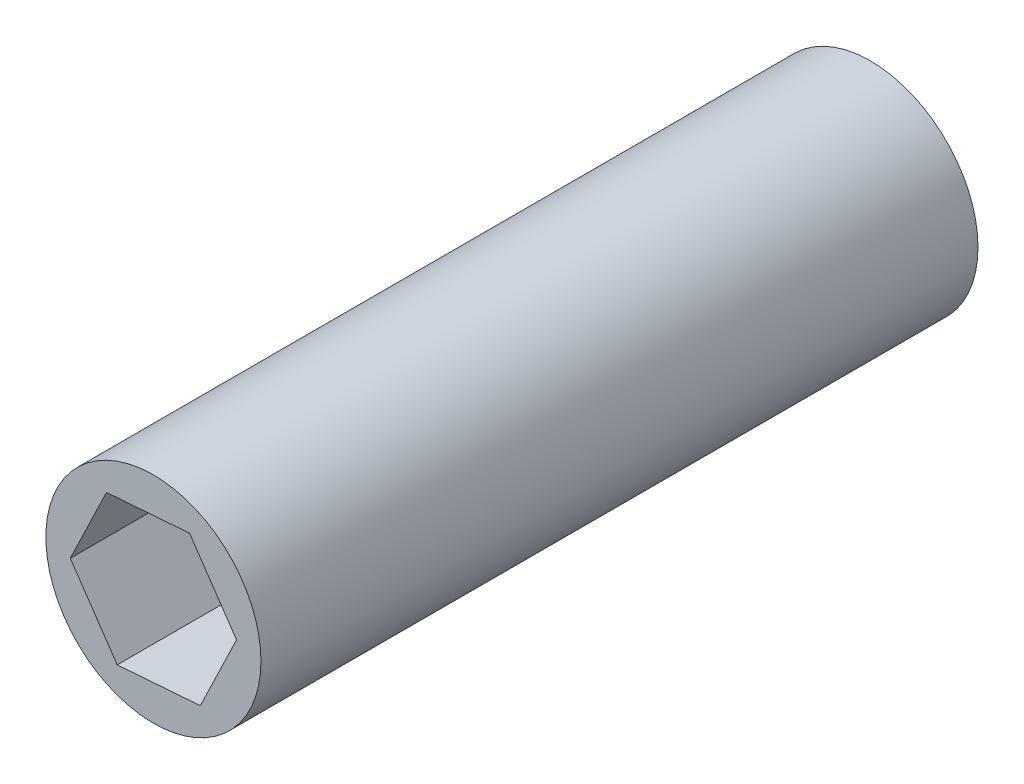
ISO-10303-21;
HEADER;
FILE_DESCRIPTION(('STEP AP214'),'2;1');
FILE_NAME('part.step','',(''),(''),'','','');
FILE_SCHEMA(('AUTOMOTIVE_DESIGN { 1 0 10303 214 1 1 1 1 }'));
ENDSEC;
DATA;
#1=APPLICATION_CONTEXT('core data for automotive mechanical design processes');
#2=APPLICATION_PROTOCOL_DEFINITION('international standard','automotive_design',2000,#1);
#3=PRODUCT_CONTEXT('',#1,'mechanical');
#4=PRODUCT('Part','Part','',(#3));
#5=PRODUCT_RELATED_PRODUCT_CATEGORY('part','',(#4));
#6=PRODUCT_DEFINITION_FORMATION('','',#4);
#7=PRODUCT_DEFINITION_CONTEXT('part definition',#1,'design');
#8=PRODUCT_DEFINITION('design','',#6,#7);
#9=PRODUCT_DEFINITION_SHAPE('','',#8);
#10=(LENGTH_UNIT() NAMED_UNIT(*) SI_UNIT(.MILLI.,.METRE.));
#11=(NAMED_UNIT(*) PLANE_ANGLE_UNIT() SI_UNIT($,.RADIAN.));
#12=(NAMED_UNIT(*) SI_UNIT($,.STERADIAN.) SOLID_ANGLE_UNIT());
#13=UNCERTAINTY_MEASURE_WITH_UNIT(LENGTH_MEASURE(1.E-05),#10,'distance_accuracy_value','');
#14=(GEOMETRIC_REPRESENTATION_CONTEXT(3) GLOBAL_UNCERTAINTY_ASSIGNED_CONTEXT((#13)) GLOBAL_UNIT_ASSIGNED_CONTEXT((#10,
#11,#12)) REPRESENTATION_CONTEXT('',''));
#15=CARTESIAN_POINT('',(0.,0.,0.));
#16=DIRECTION('',(0.,0.,1.));
#17=DIRECTION('',(1.,0.,0.));
#18=AXIS2_PLACEMENT_3D('',#15,#16,#17);
#19=CARTESIAN_POINT('',(0.,0.,10.));
#20=DIRECTION('',(0.,0.,-1.));
#21=DIRECTION('',(-1.,0.,0.));
#22=AXIS2_PLACEMENT_3D('',#19,#20,#21);
#23=CYLINDRICAL_SURFACE('',#22,1.5);
#24=CARTESIAN_POINT('',(0.,0.,10.));
#25=DIRECTION('',(0.,0.,1.));
#26=DIRECTION('',(1.,0.,0.));
#27=AXIS2_PLACEMENT_3D('',#24,#25,#26);
#28=CIRCLE('',#27,1.5);
#29=CARTESIAN_POINT('',(1.5,0.,10.));
#30=VERTEX_POINT('',#29);
#31=EDGE_CURVE('E11',#30,#30,#28,.T.);
#32=ORIENTED_EDGE('',*,*,#31,.F.);
#33=EDGE_LOOP('',(#32));
#34=FACE_BOUND('',#33,.T.);
#35=CARTESIAN_POINT('',(0.,0.,0.));
#36=DIRECTION('',(0.,0.,1.));
#37=DIRECTION('',(1.,0.,0.));
#38=AXIS2_PLACEMENT_3D('',#35,#36,#37);
#39=CIRCLE('',#38,1.5);
#40=CARTESIAN_POINT('',(1.5,0.,0.));
#41=VERTEX_POINT('',#40);
#42=EDGE_CURVE('E37',#41,#41,#39,.T.);
#43=ORIENTED_EDGE('',*,*,#42,.T.);
#44=EDGE_LOOP('',(#43));
#45=FACE_BOUND('',#44,.T.);
#46=ADVANCED_FACE('F34',(#34,#45),#23,.T.);
#47=CARTESIAN_POINT('',(0.,0.,10.));
#48=DIRECTION('',(0.,0.,1.));
#49=DIRECTION('',(1.,0.,0.));
#50=AXIS2_PLACEMENT_3D('',#47,#48,#49);
#51=PLANE('',#50);
#52=DIRECTION('',(0.997226662641607,0.0744243462630441,0.));
#53=VECTOR('',#52,1.);
#54=CARTESIAN_POINT('',(-0.50460022829491,-1.04699187789675,10.));
#55=LINE('',#54,#53);
#56=CARTESIAN_POINT('',(-0.50460022829491,-1.04699187789675,10.));
#57=VERTEX_POINT('',#56);
#58=CARTESIAN_POINT('',(0.654421449667105,-0.960492555407194,10.));
#59=VERTEX_POINT('',#58);
#60=EDGE_CURVE('E48',#57,#59,#55,.T.);
#61=ORIENTED_EDGE('',*,*,#60,.F.);
#62=DIRECTION('',(0.563066705844649,-0.826411450047284,0.));
#63=VECTOR('',#62,1.);
#64=CARTESIAN_POINT('',(-1.15902167796201,-0.0864993224895553,10.));
#65=LINE('',#64,#63);
#66=CARTESIAN_POINT('',(-1.15902167796201,-0.0864993224895553,10.));
#67=VERTEX_POINT('',#66);
#68=EDGE_CURVE('E131',#67,#57,#65,.T.);
#69=ORIENTED_EDGE('',*,*,#68,.F.);
#70=DIRECTION('',(-0.434159956796958,-0.900835796310329,0.));
#71=VECTOR('',#70,1.);
#72=CARTESIAN_POINT('',(-0.654421449667105,0.960492555407194,10.));
#73=LINE('',#72,#71);
#74=CARTESIAN_POINT('',(-0.654421449667105,0.960492555407194,10.));
#75=VERTEX_POINT('',#74);
#76=EDGE_CURVE('E129',#75,#67,#73,.T.);
#77=ORIENTED_EDGE('',*,*,#76,.F.);
#78=DIRECTION('',(-0.997226662641607,-0.074424346263044,0.));
#79=VECTOR('',#78,1.);
#80=CARTESIAN_POINT('',(0.50460022829491,1.04699187789675,10.));
#81=LINE('',#80,#79);
#82=CARTESIAN_POINT('',(0.50460022829491,1.04699187789675,10.));
#83=VERTEX_POINT('',#82);
#84=EDGE_CURVE('E96',#83,#75,#81,.T.);
#85=ORIENTED_EDGE('',*,*,#84,.F.);
#86=DIRECTION('',(-0.563066705844649,0.826411450047284,0.));
#87=VECTOR('',#86,1.);
#88=CARTESIAN_POINT('',(1.15902167796202,0.0864993224895553,10.));
#89=LINE('',#88,#87);
#90=CARTESIAN_POINT('',(1.15902167796202,0.0864993224895553,10.));
#91=VERTEX_POINT('',#90);
#92=EDGE_CURVE('E125',#91,#83,#89,.T.);
#93=ORIENTED_EDGE('',*,*,#92,.F.);
#94=DIRECTION('',(0.434159956796958,0.900835796310328,0.));
#95=VECTOR('',#94,1.);
#96=CARTESIAN_POINT('',(0.654421449667105,-0.960492555407194,10.));
#97=LINE('',#96,#95);
#98=EDGE_CURVE('E122',#59,#91,#97,.T.);
#99=ORIENTED_EDGE('',*,*,#98,.F.);
#100=EDGE_LOOP('',(#61,#69,#77,#85,#93,#99));
#101=FACE_BOUND('',#100,.T.);
#102=ORIENTED_EDGE('',*,*,#31,.T.);
#103=EDGE_LOOP('',(#102));
#104=FACE_BOUND('',#103,.T.);
#105=ADVANCED_FACE('F144',(#101,#104),#51,.T.);
#106=CARTESIAN_POINT('',(0.,0.,0.));
#107=DIRECTION('',(0.,0.,1.));
#108=DIRECTION('',(1.,0.,0.));
#109=AXIS2_PLACEMENT_3D('',#106,#107,#108);
#110=PLANE('',#109);
#111=ORIENTED_EDGE('',*,*,#42,.F.);
#112=EDGE_LOOP('',(#111));
#113=FACE_BOUND('',#112,.T.);
#114=ADVANCED_FACE('F153',(#113),#110,.F.);
#115=CARTESIAN_POINT('',(-0.50460022829491,-1.04699187789675,7.));
#116=DIRECTION('',(0.0744243462630441,-0.997226662641608,0.));
#117=DIRECTION('',(0.997226662641608,0.0744243462630441,0.));
#118=AXIS2_PLACEMENT_3D('',#115,#116,#117);
#119=PLANE('',#118);
#120=ORIENTED_EDGE('',*,*,#60,.T.);
#121=DIRECTION('',(0.,0.,1.));
#122=VECTOR('',#121,1.);
#123=CARTESIAN_POINT('',(0.654421449667105,-0.960492555407194,7.));
#124=LINE('',#123,#122);
#125=CARTESIAN_POINT('',(0.654421449667105,-0.960492555407194,7.));
#126=VERTEX_POINT('',#125);
#127=EDGE_CURVE('E78',#126,#59,#124,.T.);
#128=ORIENTED_EDGE('',*,*,#127,.F.);
#129=DIRECTION('',(0.997226662641607,0.0744243462630441,0.));
#130=VECTOR('',#129,1.);
#131=CARTESIAN_POINT('',(-0.50460022829491,-1.04699187789675,7.));
#132=LINE('',#131,#130);
#133=CARTESIAN_POINT('',(-0.50460022829491,-1.04699187789675,7.));
#134=VERTEX_POINT('',#133);
#135=EDGE_CURVE('E133',#134,#126,#132,.T.);
#136=ORIENTED_EDGE('',*,*,#135,.F.);
#137=DIRECTION('',(0.,0.,1.));
#138=VECTOR('',#137,1.);
#139=CARTESIAN_POINT('',(-0.50460022829491,-1.04699187789675,7.));
#140=LINE('',#139,#138);
#141=EDGE_CURVE('E56',#134,#57,#140,.T.);
#142=ORIENTED_EDGE('',*,*,#141,.T.);
#143=EDGE_LOOP('',(#120,#128,#136,#142));
#144=FACE_BOUND('',#143,.T.);
#145=ADVANCED_FACE('F150',(#144),#119,.F.);
#146=CARTESIAN_POINT('',(-1.15902167796201,-0.0864993224895553,7.));
#147=DIRECTION('',(-0.826411450047284,-0.563066705844649,0.));
#148=DIRECTION('',(0.563066705844649,-0.826411450047284,0.));
#149=AXIS2_PLACEMENT_3D('',#146,#147,#148);
#150=PLANE('',#149);
#151=ORIENTED_EDGE('',*,*,#68,.T.);
#152=ORIENTED_EDGE('',*,*,#141,.F.);
#153=DIRECTION('',(0.563066705844649,-0.826411450047284,0.));
#154=VECTOR('',#153,1.);
#155=CARTESIAN_POINT('',(-1.15902167796201,-0.0864993224895553,7.));
#156=LINE('',#155,#154);
#157=CARTESIAN_POINT('',(-1.15902167796201,-0.0864993224895553,7.));
#158=VERTEX_POINT('',#157);
#159=EDGE_CURVE('E108',#158,#134,#156,.T.);
#160=ORIENTED_EDGE('',*,*,#159,.F.);
#161=DIRECTION('',(0.,0.,1.));
#162=VECTOR('',#161,1.);
#163=CARTESIAN_POINT('',(-1.15902167796201,-0.0864993224895553,7.));
#164=LINE('',#163,#162);
#165=EDGE_CURVE('E100',#158,#67,#164,.T.);
#166=ORIENTED_EDGE('',*,*,#165,.T.);
#167=EDGE_LOOP('',(#151,#152,#160,#166));
#168=FACE_BOUND('',#167,.T.);
#169=ADVANCED_FACE('F152',(#168),#150,.F.);
#170=CARTESIAN_POINT('',(-0.654421449667105,0.960492555407194,7.));
#171=DIRECTION('',(-0.900835796310328,0.434159956796958,0.));
#172=DIRECTION('',(-0.434159956796958,-0.900835796310328,0.));
#173=AXIS2_PLACEMENT_3D('',#170,#171,#172);
#174=PLANE('',#173);
#175=ORIENTED_EDGE('',*,*,#76,.T.);
#176=ORIENTED_EDGE('',*,*,#165,.F.);
#177=DIRECTION('',(-0.434159956796958,-0.900835796310329,0.));
#178=VECTOR('',#177,1.);
#179=CARTESIAN_POINT('',(-0.654421449667105,0.960492555407194,7.));
#180=LINE('',#179,#178);
#181=CARTESIAN_POINT('',(-0.654421449667105,0.960492555407194,7.));
#182=VERTEX_POINT('',#181);
#183=EDGE_CURVE('E104',#182,#158,#180,.T.);
#184=ORIENTED_EDGE('',*,*,#183,.F.);
#185=DIRECTION('',(0.,0.,1.));
#186=VECTOR('',#185,1.);
#187=CARTESIAN_POINT('',(-0.654421449667105,0.960492555407194,7.));
#188=LINE('',#187,#186);
#189=EDGE_CURVE('E89',#182,#75,#188,.T.);
#190=ORIENTED_EDGE('',*,*,#189,.T.);
#191=EDGE_LOOP('',(#175,#176,#184,#190));
#192=FACE_BOUND('',#191,.T.);
#193=ADVANCED_FACE('F105',(#192),#174,.F.);
#194=CARTESIAN_POINT('',(0.50460022829491,1.04699187789675,7.));
#195=DIRECTION('',(-0.074424346263044,0.997226662641608,0.));
#196=DIRECTION('',(-0.997226662641608,-0.074424346263044,0.));
#197=AXIS2_PLACEMENT_3D('',#194,#195,#196);
#198=PLANE('',#197);
#199=ORIENTED_EDGE('',*,*,#84,.T.);
#200=ORIENTED_EDGE('',*,*,#189,.F.);
#201=DIRECTION('',(-0.997226662641607,-0.074424346263044,0.));
#202=VECTOR('',#201,1.);
#203=CARTESIAN_POINT('',(0.50460022829491,1.04699187789675,7.));
#204=LINE('',#203,#202);
#205=CARTESIAN_POINT('',(0.50460022829491,1.04699187789675,7.));
#206=VERTEX_POINT('',#205);
#207=EDGE_CURVE('E93',#206,#182,#204,.T.);
#208=ORIENTED_EDGE('',*,*,#207,.F.);
#209=DIRECTION('',(0.,0.,1.));
#210=VECTOR('',#209,1.);
#211=CARTESIAN_POINT('',(0.50460022829491,1.04699187789675,7.));
#212=LINE('',#211,#210);
#213=EDGE_CURVE('E101',#206,#83,#212,.T.);
#214=ORIENTED_EDGE('',*,*,#213,.T.);
#215=EDGE_LOOP('',(#199,#200,#208,#214));
#216=FACE_BOUND('',#215,.T.);
#217=ADVANCED_FACE('F91',(#216),#198,.F.);
#218=CARTESIAN_POINT('',(1.15902167796202,0.0864993224895553,7.));
#219=DIRECTION('',(0.826411450047284,0.563066705844649,0.));
#220=DIRECTION('',(-0.563066705844649,0.826411450047284,0.));
#221=AXIS2_PLACEMENT_3D('',#218,#219,#220);
#222=PLANE('',#221);
#223=ORIENTED_EDGE('',*,*,#92,.T.);
#224=ORIENTED_EDGE('',*,*,#213,.F.);
#225=DIRECTION('',(-0.563066705844649,0.826411450047284,0.));
#226=VECTOR('',#225,1.);
#227=CARTESIAN_POINT('',(1.15902167796202,0.0864993224895553,7.));
#228=LINE('',#227,#226);
#229=CARTESIAN_POINT('',(1.15902167796202,0.0864993224895553,7.));
#230=VERTEX_POINT('',#229);
#231=EDGE_CURVE('E114',#230,#206,#228,.T.);
#232=ORIENTED_EDGE('',*,*,#231,.F.);
#233=DIRECTION('',(0.,0.,1.));
#234=VECTOR('',#233,1.);
#235=CARTESIAN_POINT('',(1.15902167796202,0.0864993224895553,7.));
#236=LINE('',#235,#234);
#237=EDGE_CURVE('E137',#230,#91,#236,.T.);
#238=ORIENTED_EDGE('',*,*,#237,.T.);
#239=EDGE_LOOP('',(#223,#224,#232,#238));
#240=FACE_BOUND('',#239,.T.);
#241=ADVANCED_FACE('F148',(#240),#222,.F.);
#242=CARTESIAN_POINT('',(0.654421449667105,-0.960492555407194,7.));
#243=DIRECTION('',(0.900835796310328,-0.434159956796958,0.));
#244=DIRECTION('',(0.434159956796958,0.900835796310329,0.));
#245=AXIS2_PLACEMENT_3D('',#242,#243,#244);
#246=PLANE('',#245);
#247=ORIENTED_EDGE('',*,*,#98,.T.);
#248=ORIENTED_EDGE('',*,*,#237,.F.);
#249=DIRECTION('',(0.434159956796958,0.900835796310328,0.));
#250=VECTOR('',#249,1.);
#251=CARTESIAN_POINT('',(0.654421449667105,-0.960492555407194,7.));
#252=LINE('',#251,#250);
#253=EDGE_CURVE('E116',#126,#230,#252,.T.);
#254=ORIENTED_EDGE('',*,*,#253,.F.);
#255=ORIENTED_EDGE('',*,*,#127,.T.);
#256=EDGE_LOOP('',(#247,#248,#254,#255));
#257=FACE_BOUND('',#256,.T.);
#258=ADVANCED_FACE('F141',(#257),#246,.F.);
#259=CARTESIAN_POINT('',(0.,0.,7.));
#260=DIRECTION('',(0.,0.,1.));
#261=DIRECTION('',(1.,0.,0.));
#262=AXIS2_PLACEMENT_3D('',#259,#260,#261);
#263=PLANE('',#262);
#264=ORIENTED_EDGE('',*,*,#135,.T.);
#265=ORIENTED_EDGE('',*,*,#253,.T.);
#266=ORIENTED_EDGE('',*,*,#231,.T.);
#267=ORIENTED_EDGE('',*,*,#207,.T.);
#268=ORIENTED_EDGE('',*,*,#183,.T.);
#269=ORIENTED_EDGE('',*,*,#159,.T.);
#270=EDGE_LOOP('',(#264,#265,#266,#267,#268,#269));
#271=FACE_BOUND('',#270,.T.);
#272=ADVANCED_FACE('F111',(#271),#263,.T.);
#273=CLOSED_SHELL('',(#46,#105,#114,#145,#169,#193,#217,#241,#258,#272));
#274=MANIFOLD_SOLID_BREP('B2',#273);
#275=ADVANCED_BREP_SHAPE_REPRESENTATION('',(#18,#274),#14);
#276=SHAPE_DEFINITION_REPRESENTATION(#9,#275);
ENDSEC;
END-ISO-10303-21;
